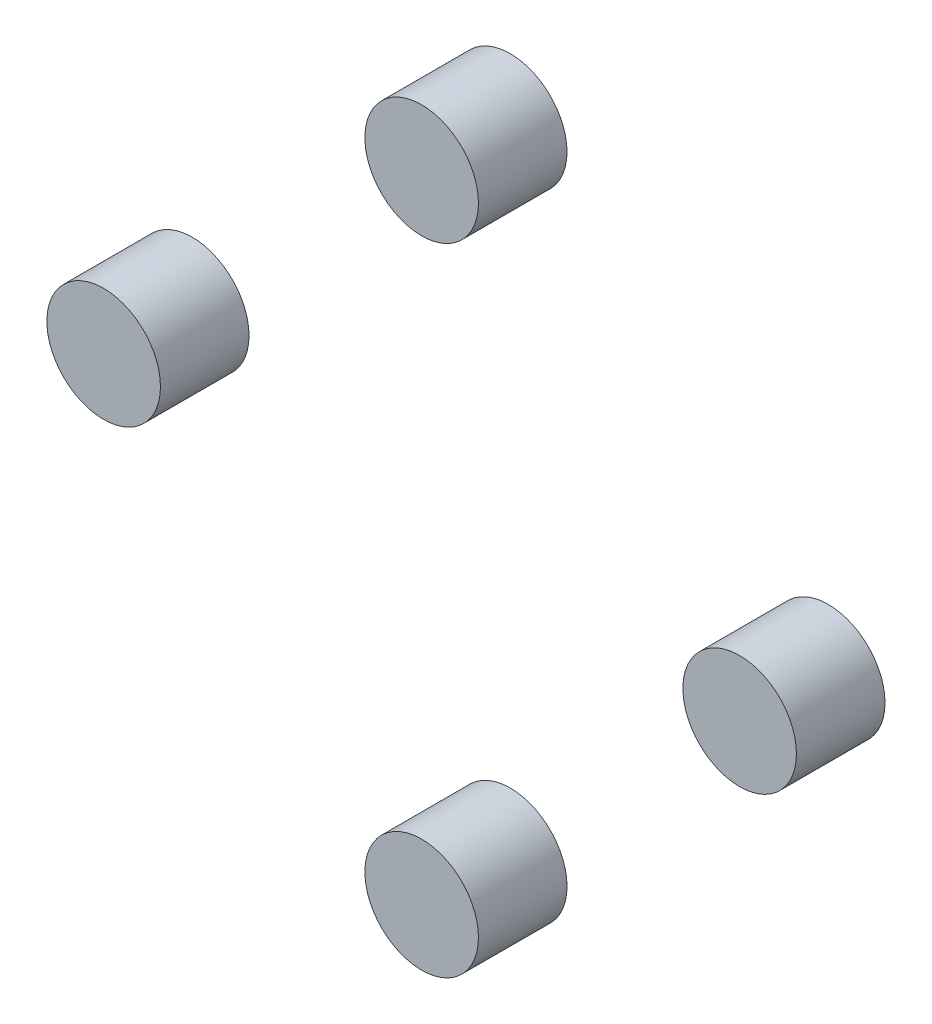
ISO-10303-21;
HEADER;
FILE_DESCRIPTION(('STEP AP214'),'2;1');
FILE_NAME('part.step','',(''),(''),'','','');
FILE_SCHEMA(('AUTOMOTIVE_DESIGN { 1 0 10303 214 1 1 1 1 }'));
ENDSEC;
DATA;
#1=APPLICATION_CONTEXT('core data for automotive mechanical design processes');
#2=APPLICATION_PROTOCOL_DEFINITION('international standard','automotive_design',2000,#1);
#3=PRODUCT_CONTEXT('',#1,'mechanical');
#4=PRODUCT('Part','Part','',(#3));
#5=PRODUCT_RELATED_PRODUCT_CATEGORY('part','',(#4));
#6=PRODUCT_DEFINITION_FORMATION('','',#4);
#7=PRODUCT_DEFINITION_CONTEXT('part definition',#1,'design');
#8=PRODUCT_DEFINITION('design','',#6,#7);
#9=PRODUCT_DEFINITION_SHAPE('','',#8);
#10=(LENGTH_UNIT() NAMED_UNIT(*) SI_UNIT(.MILLI.,.METRE.));
#11=(NAMED_UNIT(*) PLANE_ANGLE_UNIT() SI_UNIT($,.RADIAN.));
#12=(NAMED_UNIT(*) SI_UNIT($,.STERADIAN.) SOLID_ANGLE_UNIT());
#13=UNCERTAINTY_MEASURE_WITH_UNIT(LENGTH_MEASURE(1.E-05),#10,'distance_accuracy_value','');
#14=(GEOMETRIC_REPRESENTATION_CONTEXT(3) GLOBAL_UNCERTAINTY_ASSIGNED_CONTEXT((#13)) GLOBAL_UNIT_ASSIGNED_CONTEXT((#10,
#11,#12)) REPRESENTATION_CONTEXT('',''));
#15=CARTESIAN_POINT('',(0.,0.,0.));
#16=DIRECTION('',(0.,0.,1.));
#17=DIRECTION('',(1.,0.,0.));
#18=AXIS2_PLACEMENT_3D('',#15,#16,#17);
#19=CARTESIAN_POINT('',(7.,0.,0.));
#20=DIRECTION('',(0.,0.,1.));
#21=DIRECTION('',(1.,0.,0.));
#22=AXIS2_PLACEMENT_3D('',#19,#20,#21);
#23=PLANE('',#22);
#24=CARTESIAN_POINT('',(7.,0.,0.));
#25=DIRECTION('',(0.,0.,1.));
#26=DIRECTION('',(1.,0.,0.));
#27=AXIS2_PLACEMENT_3D('',#24,#25,#26);
#28=CIRCLE('',#27,1.25);
#29=CARTESIAN_POINT('',(8.25,0.,0.));
#30=VERTEX_POINT('',#29);
#31=EDGE_CURVE('P0_E10',#30,#30,#28,.T.);
#32=ORIENTED_EDGE('',*,*,#31,.F.);
#33=EDGE_LOOP('',(#32));
#34=FACE_BOUND('',#33,.T.);
#35=ADVANCED_FACE('P0_F15',(#34),#23,.F.);
#36=CARTESIAN_POINT('',(7.,0.,1.95));
#37=DIRECTION('',(0.,0.,1.));
#38=DIRECTION('',(1.,0.,0.));
#39=AXIS2_PLACEMENT_3D('',#36,#37,#38);
#40=PLANE('',#39);
#41=CARTESIAN_POINT('',(7.,0.,1.95));
#42=DIRECTION('',(0.,0.,1.));
#43=DIRECTION('',(1.,0.,0.));
#44=AXIS2_PLACEMENT_3D('',#41,#42,#43);
#45=CIRCLE('',#44,1.25);
#46=CARTESIAN_POINT('',(8.25,0.,1.95));
#47=VERTEX_POINT('',#46);
#48=EDGE_CURVE('P0_E22',#47,#47,#45,.T.);
#49=ORIENTED_EDGE('',*,*,#48,.T.);
#50=EDGE_LOOP('',(#49));
#51=FACE_BOUND('',#50,.T.);
#52=ADVANCED_FACE('P0_F35',(#51),#40,.T.);
#53=CARTESIAN_POINT('',(7.,0.,0.));
#54=DIRECTION('',(0.,0.,1.));
#55=DIRECTION('',(1.,0.,0.));
#56=AXIS2_PLACEMENT_3D('',#53,#54,#55);
#57=CYLINDRICAL_SURFACE('',#56,1.25);
#58=ORIENTED_EDGE('',*,*,#48,.F.);
#59=EDGE_LOOP('',(#58));
#60=FACE_BOUND('',#59,.T.);
#61=ORIENTED_EDGE('',*,*,#31,.T.);
#62=EDGE_LOOP('',(#61));
#63=FACE_BOUND('',#62,.T.);
#64=ADVANCED_FACE('P0_F37',(#60,#63),#57,.T.);
#65=CLOSED_SHELL('',(#35,#52,#64));
#66=MANIFOLD_SOLID_BREP('P0_B1',#65);
#67=CARTESIAN_POINT('',(0.,7.,0.));
#68=DIRECTION('',(0.,0.,1.));
#69=DIRECTION('',(1.,0.,0.));
#70=AXIS2_PLACEMENT_3D('',#67,#68,#69);
#71=PLANE('',#70);
#72=CARTESIAN_POINT('',(0.,7.,0.));
#73=DIRECTION('',(0.,0.,1.));
#74=DIRECTION('',(1.,0.,0.));
#75=AXIS2_PLACEMENT_3D('',#72,#73,#74);
#76=CIRCLE('',#75,1.25);
#77=CARTESIAN_POINT('',(1.25,7.,0.));
#78=VERTEX_POINT('',#77);
#79=EDGE_CURVE('P1_E10',#78,#78,#76,.T.);
#80=ORIENTED_EDGE('',*,*,#79,.F.);
#81=EDGE_LOOP('',(#80));
#82=FACE_BOUND('',#81,.T.);
#83=ADVANCED_FACE('P1_F15',(#82),#71,.F.);
#84=CARTESIAN_POINT('',(0.,7.,1.95));
#85=DIRECTION('',(0.,0.,1.));
#86=DIRECTION('',(1.,0.,0.));
#87=AXIS2_PLACEMENT_3D('',#84,#85,#86);
#88=PLANE('',#87);
#89=CARTESIAN_POINT('',(0.,7.,1.95));
#90=DIRECTION('',(0.,0.,1.));
#91=DIRECTION('',(1.,0.,0.));
#92=AXIS2_PLACEMENT_3D('',#89,#90,#91);
#93=CIRCLE('',#92,1.25);
#94=CARTESIAN_POINT('',(1.25,7.,1.95));
#95=VERTEX_POINT('',#94);
#96=EDGE_CURVE('P1_E22',#95,#95,#93,.T.);
#97=ORIENTED_EDGE('',*,*,#96,.T.);
#98=EDGE_LOOP('',(#97));
#99=FACE_BOUND('',#98,.T.);
#100=ADVANCED_FACE('P1_F35',(#99),#88,.T.);
#101=CARTESIAN_POINT('',(0.,7.,0.));
#102=DIRECTION('',(0.,0.,1.));
#103=DIRECTION('',(1.,0.,0.));
#104=AXIS2_PLACEMENT_3D('',#101,#102,#103);
#105=CYLINDRICAL_SURFACE('',#104,1.25);
#106=ORIENTED_EDGE('',*,*,#96,.F.);
#107=EDGE_LOOP('',(#106));
#108=FACE_BOUND('',#107,.T.);
#109=ORIENTED_EDGE('',*,*,#79,.T.);
#110=EDGE_LOOP('',(#109));
#111=FACE_BOUND('',#110,.T.);
#112=ADVANCED_FACE('P1_F37',(#108,#111),#105,.T.);
#113=CLOSED_SHELL('',(#83,#100,#112));
#114=MANIFOLD_SOLID_BREP('P1_B1',#113);
#115=CARTESIAN_POINT('',(-7.,0.,0.));
#116=DIRECTION('',(0.,0.,1.));
#117=DIRECTION('',(1.,0.,0.));
#118=AXIS2_PLACEMENT_3D('',#115,#116,#117);
#119=PLANE('',#118);
#120=CARTESIAN_POINT('',(-7.,0.,0.));
#121=DIRECTION('',(0.,0.,1.));
#122=DIRECTION('',(1.,0.,0.));
#123=AXIS2_PLACEMENT_3D('',#120,#121,#122);
#124=CIRCLE('',#123,1.25);
#125=CARTESIAN_POINT('',(-5.75,0.,0.));
#126=VERTEX_POINT('',#125);
#127=EDGE_CURVE('P2_E10',#126,#126,#124,.T.);
#128=ORIENTED_EDGE('',*,*,#127,.F.);
#129=EDGE_LOOP('',(#128));
#130=FACE_BOUND('',#129,.T.);
#131=ADVANCED_FACE('P2_F15',(#130),#119,.F.);
#132=CARTESIAN_POINT('',(-7.,0.,1.95));
#133=DIRECTION('',(0.,0.,1.));
#134=DIRECTION('',(1.,0.,0.));
#135=AXIS2_PLACEMENT_3D('',#132,#133,#134);
#136=PLANE('',#135);
#137=CARTESIAN_POINT('',(-7.,0.,1.95));
#138=DIRECTION('',(0.,0.,1.));
#139=DIRECTION('',(1.,0.,0.));
#140=AXIS2_PLACEMENT_3D('',#137,#138,#139);
#141=CIRCLE('',#140,1.25);
#142=CARTESIAN_POINT('',(-5.75,0.,1.95));
#143=VERTEX_POINT('',#142);
#144=EDGE_CURVE('P2_E22',#143,#143,#141,.T.);
#145=ORIENTED_EDGE('',*,*,#144,.T.);
#146=EDGE_LOOP('',(#145));
#147=FACE_BOUND('',#146,.T.);
#148=ADVANCED_FACE('P2_F35',(#147),#136,.T.);
#149=CARTESIAN_POINT('',(-7.,0.,0.));
#150=DIRECTION('',(0.,0.,1.));
#151=DIRECTION('',(1.,0.,0.));
#152=AXIS2_PLACEMENT_3D('',#149,#150,#151);
#153=CYLINDRICAL_SURFACE('',#152,1.25);
#154=ORIENTED_EDGE('',*,*,#144,.F.);
#155=EDGE_LOOP('',(#154));
#156=FACE_BOUND('',#155,.T.);
#157=ORIENTED_EDGE('',*,*,#127,.T.);
#158=EDGE_LOOP('',(#157));
#159=FACE_BOUND('',#158,.T.);
#160=ADVANCED_FACE('P2_F37',(#156,#159),#153,.T.);
#161=CLOSED_SHELL('',(#131,#148,#160));
#162=MANIFOLD_SOLID_BREP('P2_B1',#161);
#163=CARTESIAN_POINT('',(0.,-7.,0.));
#164=DIRECTION('',(0.,0.,1.));
#165=DIRECTION('',(1.,0.,0.));
#166=AXIS2_PLACEMENT_3D('',#163,#164,#165);
#167=PLANE('',#166);
#168=CARTESIAN_POINT('',(0.,-7.,0.));
#169=DIRECTION('',(0.,0.,1.));
#170=DIRECTION('',(1.,0.,0.));
#171=AXIS2_PLACEMENT_3D('',#168,#169,#170);
#172=CIRCLE('',#171,1.25);
#173=CARTESIAN_POINT('',(1.25,-7.,0.));
#174=VERTEX_POINT('',#173);
#175=EDGE_CURVE('P3_E9',#174,#174,#172,.T.);
#176=ORIENTED_EDGE('',*,*,#175,.F.);
#177=EDGE_LOOP('',(#176));
#178=FACE_BOUND('',#177,.T.);
#179=ADVANCED_FACE('P3_F14',(#178),#167,.F.);
#180=CARTESIAN_POINT('',(0.,-7.,1.95));
#181=DIRECTION('',(0.,0.,1.));
#182=DIRECTION('',(1.,0.,0.));
#183=AXIS2_PLACEMENT_3D('',#180,#181,#182);
#184=PLANE('',#183);
#185=CARTESIAN_POINT('',(0.,-7.,1.95));
#186=DIRECTION('',(0.,0.,1.));
#187=DIRECTION('',(1.,0.,0.));
#188=AXIS2_PLACEMENT_3D('',#185,#186,#187);
#189=CIRCLE('',#188,1.25);
#190=CARTESIAN_POINT('',(1.25,-7.,1.95));
#191=VERTEX_POINT('',#190);
#192=EDGE_CURVE('P3_E17',#191,#191,#189,.T.);
#193=ORIENTED_EDGE('',*,*,#192,.T.);
#194=EDGE_LOOP('',(#193));
#195=FACE_BOUND('',#194,.T.);
#196=ADVANCED_FACE('P3_F34',(#195),#184,.T.);
#197=CARTESIAN_POINT('',(0.,-7.,0.));
#198=DIRECTION('',(0.,0.,1.));
#199=DIRECTION('',(1.,0.,0.));
#200=AXIS2_PLACEMENT_3D('',#197,#198,#199);
#201=CYLINDRICAL_SURFACE('',#200,1.25);
#202=ORIENTED_EDGE('',*,*,#192,.F.);
#203=EDGE_LOOP('',(#202));
#204=FACE_BOUND('',#203,.T.);
#205=ORIENTED_EDGE('',*,*,#175,.T.);
#206=EDGE_LOOP('',(#205));
#207=FACE_BOUND('',#206,.T.);
#208=ADVANCED_FACE('P3_F36',(#204,#207),#201,.T.);
#209=CLOSED_SHELL('',(#179,#196,#208));
#210=MANIFOLD_SOLID_BREP('P3_B1',#209);
#211=ADVANCED_BREP_SHAPE_REPRESENTATION('',(#18,#66,#114,#162,#210),#14);
#212=SHAPE_DEFINITION_REPRESENTATION(#9,#211);
ENDSEC;
END-ISO-10303-21;
